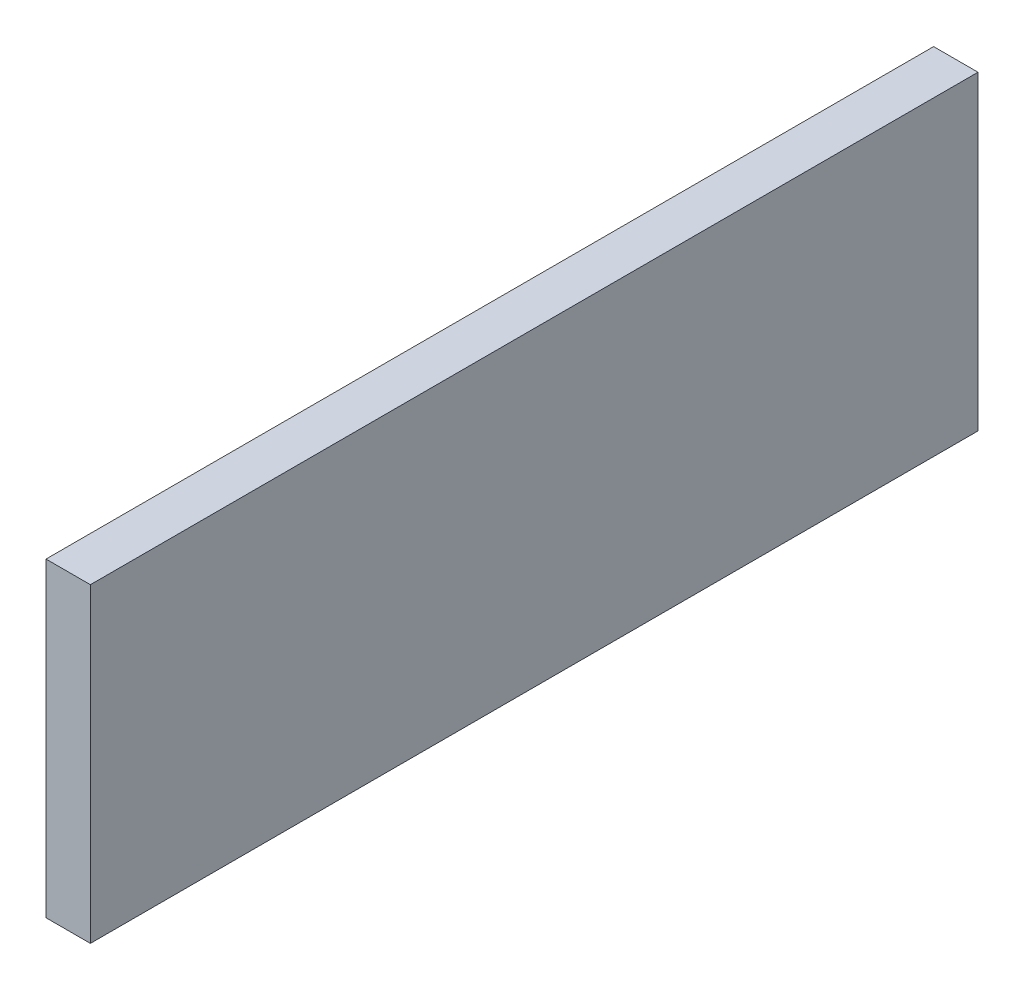
ISO-10303-21;
HEADER;
FILE_DESCRIPTION(('STEP AP214'),'2;1');
FILE_NAME('part.step','',(''),(''),'','','');
FILE_SCHEMA(('AUTOMOTIVE_DESIGN { 1 0 10303 214 1 1 1 1 }'));
ENDSEC;
DATA;
#1=APPLICATION_CONTEXT('core data for automotive mechanical design processes');
#2=APPLICATION_PROTOCOL_DEFINITION('international standard','automotive_design',2000,#1);
#3=PRODUCT_CONTEXT('',#1,'mechanical');
#4=PRODUCT('Part','Part','',(#3));
#5=PRODUCT_RELATED_PRODUCT_CATEGORY('part','',(#4));
#6=PRODUCT_DEFINITION_FORMATION('','',#4);
#7=PRODUCT_DEFINITION_CONTEXT('part definition',#1,'design');
#8=PRODUCT_DEFINITION('design','',#6,#7);
#9=PRODUCT_DEFINITION_SHAPE('','',#8);
#10=(LENGTH_UNIT() NAMED_UNIT(*) SI_UNIT(.MILLI.,.METRE.));
#11=(NAMED_UNIT(*) PLANE_ANGLE_UNIT() SI_UNIT($,.RADIAN.));
#12=(NAMED_UNIT(*) SI_UNIT($,.STERADIAN.) SOLID_ANGLE_UNIT());
#13=UNCERTAINTY_MEASURE_WITH_UNIT(LENGTH_MEASURE(1.E-05),#10,'distance_accuracy_value','');
#14=(GEOMETRIC_REPRESENTATION_CONTEXT(3) GLOBAL_UNCERTAINTY_ASSIGNED_CONTEXT((#13)) GLOBAL_UNIT_ASSIGNED_CONTEXT((#10,
#11,#12)) REPRESENTATION_CONTEXT('',''));
#15=CARTESIAN_POINT('',(0.,0.,0.));
#16=DIRECTION('',(0.,0.,1.));
#17=DIRECTION('',(1.,0.,0.));
#18=AXIS2_PLACEMENT_3D('',#15,#16,#17);
#19=CARTESIAN_POINT('',(304.8,98.425,279.4));
#20=DIRECTION('',(-1.,0.,0.));
#21=DIRECTION('',(0.,0.,1.));
#22=AXIS2_PLACEMENT_3D('',#19,#20,#21);
#23=PLANE('',#22);
#24=DIRECTION('',(0.,1.,0.));
#25=VECTOR('',#24,1.);
#26=CARTESIAN_POINT('',(304.8,98.425,25.4));
#27=LINE('',#26,#25);
#28=CARTESIAN_POINT('',(304.8,9.52500000000001,25.4));
#29=VERTEX_POINT('',#28);
#30=CARTESIAN_POINT('',(304.8,98.425,25.4));
#31=VERTEX_POINT('',#30);
#32=EDGE_CURVE('E96',#29,#31,#27,.T.);
#33=ORIENTED_EDGE('',*,*,#32,.T.);
#34=DIRECTION('',(0.,0.,-1.));
#35=VECTOR('',#34,1.);
#36=CARTESIAN_POINT('',(304.8,98.425,279.4));
#37=LINE('',#36,#35);
#38=CARTESIAN_POINT('',(304.8,98.425,279.4));
#39=VERTEX_POINT('',#38);
#40=EDGE_CURVE('E11',#39,#31,#37,.T.);
#41=ORIENTED_EDGE('',*,*,#40,.F.);
#42=DIRECTION('',(0.,1.,0.));
#43=VECTOR('',#42,1.);
#44=CARTESIAN_POINT('',(304.8,98.425,279.4));
#45=LINE('',#44,#43);
#46=CARTESIAN_POINT('',(304.8,9.52500000000001,279.4));
#47=VERTEX_POINT('',#46);
#48=EDGE_CURVE('E84',#47,#39,#45,.T.);
#49=ORIENTED_EDGE('',*,*,#48,.F.);
#50=DIRECTION('',(0.,0.,-1.));
#51=VECTOR('',#50,1.);
#52=CARTESIAN_POINT('',(304.8,9.52500000000001,279.4));
#53=LINE('',#52,#51);
#54=EDGE_CURVE('E92',#47,#29,#53,.T.);
#55=ORIENTED_EDGE('',*,*,#54,.T.);
#56=EDGE_LOOP('',(#33,#41,#49,#55));
#57=FACE_BOUND('',#56,.T.);
#58=ADVANCED_FACE('F33',(#57),#23,.F.);
#59=CARTESIAN_POINT('',(304.8,98.425,279.4));
#60=DIRECTION('',(0.,-1.,0.));
#61=DIRECTION('',(0.,0.,-1.));
#62=AXIS2_PLACEMENT_3D('',#59,#60,#61);
#63=PLANE('',#62);
#64=DIRECTION('',(-1.,0.,0.));
#65=VECTOR('',#64,1.);
#66=CARTESIAN_POINT('',(304.8,98.425,25.4));
#67=LINE('',#66,#65);
#68=CARTESIAN_POINT('',(292.1,98.425,25.4));
#69=VERTEX_POINT('',#68);
#70=EDGE_CURVE('E88',#31,#69,#67,.T.);
#71=ORIENTED_EDGE('',*,*,#70,.T.);
#72=DIRECTION('',(0.,0.,-1.));
#73=VECTOR('',#72,1.);
#74=CARTESIAN_POINT('',(292.1,98.425,279.4));
#75=LINE('',#74,#73);
#76=CARTESIAN_POINT('',(292.1,98.425,279.4));
#77=VERTEX_POINT('',#76);
#78=EDGE_CURVE('E41',#77,#69,#75,.T.);
#79=ORIENTED_EDGE('',*,*,#78,.F.);
#80=DIRECTION('',(-1.,0.,0.));
#81=VECTOR('',#80,1.);
#82=CARTESIAN_POINT('',(304.8,98.425,279.4));
#83=LINE('',#82,#81);
#84=EDGE_CURVE('E79',#39,#77,#83,.T.);
#85=ORIENTED_EDGE('',*,*,#84,.F.);
#86=ORIENTED_EDGE('',*,*,#40,.T.);
#87=EDGE_LOOP('',(#71,#79,#85,#86));
#88=FACE_BOUND('',#87,.T.);
#89=ADVANCED_FACE('F87',(#88),#63,.F.);
#90=CARTESIAN_POINT('',(292.1,98.425,279.4));
#91=DIRECTION('',(1.,0.,0.));
#92=DIRECTION('',(0.,0.,-1.));
#93=AXIS2_PLACEMENT_3D('',#90,#91,#92);
#94=PLANE('',#93);
#95=DIRECTION('',(0.,-1.,0.));
#96=VECTOR('',#95,1.);
#97=CARTESIAN_POINT('',(292.1,98.425,25.4));
#98=LINE('',#97,#96);
#99=CARTESIAN_POINT('',(292.1,9.52500000000001,25.4));
#100=VERTEX_POINT('',#99);
#101=EDGE_CURVE('E66',#69,#100,#98,.T.);
#102=ORIENTED_EDGE('',*,*,#101,.T.);
#103=DIRECTION('',(0.,0.,-1.));
#104=VECTOR('',#103,1.);
#105=CARTESIAN_POINT('',(292.1,9.52500000000001,279.4));
#106=LINE('',#105,#104);
#107=CARTESIAN_POINT('',(292.1,9.52500000000001,279.4));
#108=VERTEX_POINT('',#107);
#109=EDGE_CURVE('E89',#108,#100,#106,.T.);
#110=ORIENTED_EDGE('',*,*,#109,.F.);
#111=DIRECTION('',(0.,-1.,0.));
#112=VECTOR('',#111,1.);
#113=CARTESIAN_POINT('',(292.1,98.425,279.4));
#114=LINE('',#113,#112);
#115=EDGE_CURVE('E82',#77,#108,#114,.T.);
#116=ORIENTED_EDGE('',*,*,#115,.F.);
#117=ORIENTED_EDGE('',*,*,#78,.T.);
#118=EDGE_LOOP('',(#102,#110,#116,#117));
#119=FACE_BOUND('',#118,.T.);
#120=ADVANCED_FACE('F90',(#119),#94,.F.);
#121=CARTESIAN_POINT('',(304.8,9.52500000000001,279.4));
#122=DIRECTION('',(0.,1.,0.));
#123=DIRECTION('',(0.,0.,1.));
#124=AXIS2_PLACEMENT_3D('',#121,#122,#123);
#125=PLANE('',#124);
#126=DIRECTION('',(1.,0.,0.));
#127=VECTOR('',#126,1.);
#128=CARTESIAN_POINT('',(304.8,9.52500000000001,25.4));
#129=LINE('',#128,#127);
#130=EDGE_CURVE('E72',#100,#29,#129,.T.);
#131=ORIENTED_EDGE('',*,*,#130,.T.);
#132=ORIENTED_EDGE('',*,*,#54,.F.);
#133=DIRECTION('',(1.,0.,0.));
#134=VECTOR('',#133,1.);
#135=CARTESIAN_POINT('',(304.8,9.52500000000001,279.4));
#136=LINE('',#135,#134);
#137=EDGE_CURVE('E49',#108,#47,#136,.T.);
#138=ORIENTED_EDGE('',*,*,#137,.F.);
#139=ORIENTED_EDGE('',*,*,#109,.T.);
#140=EDGE_LOOP('',(#131,#132,#138,#139));
#141=FACE_BOUND('',#140,.T.);
#142=ADVANCED_FACE('F103',(#141),#125,.F.);
#143=CARTESIAN_POINT('',(0.,0.,279.4));
#144=DIRECTION('',(0.,0.,-1.));
#145=DIRECTION('',(-1.,0.,0.));
#146=AXIS2_PLACEMENT_3D('',#143,#144,#145);
#147=PLANE('',#146);
#148=ORIENTED_EDGE('',*,*,#48,.T.);
#149=ORIENTED_EDGE('',*,*,#84,.T.);
#150=ORIENTED_EDGE('',*,*,#115,.T.);
#151=ORIENTED_EDGE('',*,*,#137,.T.);
#152=EDGE_LOOP('',(#148,#149,#150,#151));
#153=FACE_BOUND('',#152,.T.);
#154=ADVANCED_FACE('F80',(#153),#147,.F.);
#155=CARTESIAN_POINT('',(0.,0.,25.4));
#156=DIRECTION('',(0.,0.,-1.));
#157=DIRECTION('',(-1.,0.,0.));
#158=AXIS2_PLACEMENT_3D('',#155,#156,#157);
#159=PLANE('',#158);
#160=ORIENTED_EDGE('',*,*,#32,.F.);
#161=ORIENTED_EDGE('',*,*,#130,.F.);
#162=ORIENTED_EDGE('',*,*,#101,.F.);
#163=ORIENTED_EDGE('',*,*,#70,.F.);
#164=EDGE_LOOP('',(#160,#161,#162,#163));
#165=FACE_BOUND('',#164,.T.);
#166=ADVANCED_FACE('F106',(#165),#159,.T.);
#167=CLOSED_SHELL('',(#58,#89,#120,#142,#154,#166));
#168=MANIFOLD_SOLID_BREP('B2',#167);
#169=ADVANCED_BREP_SHAPE_REPRESENTATION('',(#18,#168),#14);
#170=SHAPE_DEFINITION_REPRESENTATION(#9,#169);
ENDSEC;
END-ISO-10303-21;
